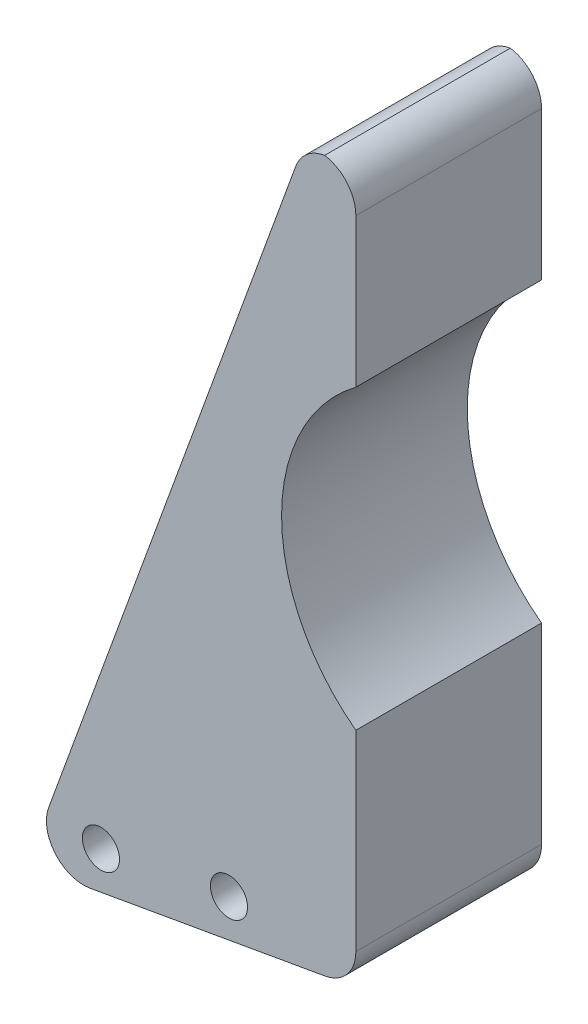
ISO-10303-21;
HEADER;
FILE_DESCRIPTION(('STEP AP214'),'2;1');
FILE_NAME('part.step','',(''),(''),'','','');
FILE_SCHEMA(('AUTOMOTIVE_DESIGN { 1 0 10303 214 1 1 1 1 }'));
ENDSEC;
DATA;
#1=APPLICATION_CONTEXT('core data for automotive mechanical design processes');
#2=APPLICATION_PROTOCOL_DEFINITION('international standard','automotive_design',2000,#1);
#3=PRODUCT_CONTEXT('',#1,'mechanical');
#4=PRODUCT('Part','Part','',(#3));
#5=PRODUCT_RELATED_PRODUCT_CATEGORY('part','',(#4));
#6=PRODUCT_DEFINITION_FORMATION('','',#4);
#7=PRODUCT_DEFINITION_CONTEXT('part definition',#1,'design');
#8=PRODUCT_DEFINITION('design','',#6,#7);
#9=PRODUCT_DEFINITION_SHAPE('','',#8);
#10=(LENGTH_UNIT() NAMED_UNIT(*) SI_UNIT(.MILLI.,.METRE.));
#11=(NAMED_UNIT(*) PLANE_ANGLE_UNIT() SI_UNIT($,.RADIAN.));
#12=(NAMED_UNIT(*) SI_UNIT($,.STERADIAN.) SOLID_ANGLE_UNIT());
#13=UNCERTAINTY_MEASURE_WITH_UNIT(LENGTH_MEASURE(1.E-05),#10,'distance_accuracy_value','');
#14=(GEOMETRIC_REPRESENTATION_CONTEXT(3) GLOBAL_UNCERTAINTY_ASSIGNED_CONTEXT((#13)) GLOBAL_UNIT_ASSIGNED_CONTEXT((#10,
#11,#12)) REPRESENTATION_CONTEXT('',''));
#15=CARTESIAN_POINT('',(0.,0.,0.));
#16=DIRECTION('',(0.,0.,1.));
#17=DIRECTION('',(1.,0.,0.));
#18=AXIS2_PLACEMENT_3D('',#15,#16,#17);
#19=CARTESIAN_POINT('',(-88.6326977710988,-15.6283359900234,50.));
#20=DIRECTION('',(-0.173648177666927,0.984807753012209,0.));
#21=DIRECTION('',(-0.984807753012209,-0.173648177666927,0.));
#22=AXIS2_PLACEMENT_3D('',#19,#20,#21);
#23=PLANE('',#22);
#24=DIRECTION('',(0.984807753012209,0.173648177666927,0.));
#25=VECTOR('',#24,1.);
#26=CARTESIAN_POINT('',(-88.6326977710988,-15.6283359900234,15.));
#27=LINE('',#26,#25);
#28=CARTESIAN_POINT('',(-71.5753271320498,-12.6206613264148,15.));
#29=VERTEX_POINT('',#28);
#30=CARTESIAN_POINT('',(-59.5101578468379,-10.4932464546169,15.));
#31=VERTEX_POINT('',#30);
#32=EDGE_CURVE('E229',#29,#31,#27,.T.);
#33=ORIENTED_EDGE('',*,*,#32,.F.);
#34=DIRECTION('',(0.,0.,-1.));
#35=VECTOR('',#34,1.);
#36=CARTESIAN_POINT('',(-71.5753271320498,-12.6206613264148,50.));
#37=LINE('',#36,#35);
#38=CARTESIAN_POINT('',(-71.5753271320498,-12.6206613264148,0.));
#39=VERTEX_POINT('',#38);
#40=EDGE_CURVE('E166',#29,#39,#37,.T.);
#41=ORIENTED_EDGE('',*,*,#40,.T.);
#42=DIRECTION('',(0.984807753012209,0.173648177666927,0.));
#43=VECTOR('',#42,1.);
#44=CARTESIAN_POINT('',(-88.6326977710988,-15.6283359900234,0.));
#45=LINE('',#44,#43);
#46=CARTESIAN_POINT('',(-8.26351822333074,-1.45708121834926,0.));
#47=VERTEX_POINT('',#46);
#48=EDGE_CURVE('E200',#39,#47,#45,.T.);
#49=ORIENTED_EDGE('',*,*,#48,.T.);
#50=DIRECTION('',(0.,0.,-1.));
#51=VECTOR('',#50,1.);
#52=CARTESIAN_POINT('',(-8.26351822333073,-1.45708121834926,50.));
#53=LINE('',#52,#51);
#54=CARTESIAN_POINT('',(-8.26351822333074,-1.45708121834926,50.));
#55=VERTEX_POINT('',#54);
#56=EDGE_CURVE('E164',#47,#55,#53,.F.);
#57=ORIENTED_EDGE('',*,*,#56,.T.);
#58=DIRECTION('',(0.984807753012209,0.173648177666927,0.));
#59=VECTOR('',#58,1.);
#60=CARTESIAN_POINT('',(-88.6326977710988,-15.6283359900234,50.));
#61=LINE('',#60,#59);
#62=CARTESIAN_POINT('',(-71.5753271320498,-12.6206613264148,50.));
#63=VERTEX_POINT('',#62);
#64=EDGE_CURVE('E194',#63,#55,#61,.T.);
#65=ORIENTED_EDGE('',*,*,#64,.F.);
#66=CARTESIAN_POINT('',(-71.5753271320498,-12.6206613264148,35.));
#67=VERTEX_POINT('',#66);
#68=EDGE_CURVE('E170',#63,#67,#37,.T.);
#69=ORIENTED_EDGE('',*,*,#68,.T.);
#70=DIRECTION('',(0.984807753012209,0.173648177666927,0.));
#71=VECTOR('',#70,1.);
#72=CARTESIAN_POINT('',(-88.6326977710988,-15.6283359900234,35.));
#73=LINE('',#72,#71);
#74=CARTESIAN_POINT('',(-59.5101578468379,-10.4932464546169,35.));
#75=VERTEX_POINT('',#74);
#76=EDGE_CURVE('E53',#67,#75,#73,.T.);
#77=ORIENTED_EDGE('',*,*,#76,.T.);
#78=DIRECTION('',(0.,0.,1.));
#79=VECTOR('',#78,1.);
#80=CARTESIAN_POINT('',(-59.5101578468379,-10.4932464546169,15.));
#81=LINE('',#80,#79);
#82=EDGE_CURVE('E142',#75,#31,#81,.F.);
#83=ORIENTED_EDGE('',*,*,#82,.T.);
#84=EDGE_LOOP('',(#33,#41,#49,#57,#65,#69,#77,#83));
#85=FACE_BOUND('',#84,.T.);
#86=ADVANCED_FACE('F39',(#85),#23,.F.);
#87=CARTESIAN_POINT('',(-68.6326977710988,-1.94753025699676,50.));
#88=DIRECTION('',(0.,0.,-1.));
#89=DIRECTION('',(-1.,0.,0.));
#90=AXIS2_PLACEMENT_3D('',#87,#88,#89);
#91=CYLINDRICAL_SURFACE('',#90,5.);
#92=CARTESIAN_POINT('',(-68.6326977710988,-1.94753025699676,0.));
#93=DIRECTION('',(0.,0.,1.));
#94=DIRECTION('',(1.,0.,0.));
#95=AXIS2_PLACEMENT_3D('',#92,#93,#94);
#96=CIRCLE('',#95,5.);
#97=CARTESIAN_POINT('',(-63.6326977710988,-1.94753025699676,0.));
#98=VERTEX_POINT('',#97);
#99=EDGE_CURVE('E213',#98,#98,#96,.T.);
#100=ORIENTED_EDGE('',*,*,#99,.F.);
#101=EDGE_LOOP('',(#100));
#102=FACE_BOUND('',#101,.T.);
#103=CARTESIAN_POINT('',(-68.6326977710988,-1.94753025699676,15.));
#104=DIRECTION('',(0.,0.,1.));
#105=DIRECTION('',(1.,0.,0.));
#106=AXIS2_PLACEMENT_3D('',#103,#104,#105);
#107=CIRCLE('',#106,5.);
#108=CARTESIAN_POINT('',(-63.6326977710988,-1.94753025699676,15.));
#109=VERTEX_POINT('',#108);
#110=EDGE_CURVE('E221',#109,#109,#107,.T.);
#111=ORIENTED_EDGE('',*,*,#110,.T.);
#112=EDGE_LOOP('',(#111));
#113=FACE_BOUND('',#112,.T.);
#114=ADVANCED_FACE('F292',(#102,#113),#91,.F.);
#115=CARTESIAN_POINT('',(-73.3118089087191,-2.77258379629269,50.));
#116=DIRECTION('',(0.,0.,-1.));
#117=DIRECTION('',(-1.,0.,0.));
#118=AXIS2_PLACEMENT_3D('',#115,#116,#117);
#119=CYLINDRICAL_SURFACE('',#118,10.);
#120=ORIENTED_EDGE('',*,*,#40,.F.);
#121=CARTESIAN_POINT('',(-73.3118089087191,-2.77258379629269,15.));
#122=DIRECTION('',(0.,0.,1.));
#123=DIRECTION('',(1.,0.,0.));
#124=AXIS2_PLACEMENT_3D('',#121,#122,#123);
#125=CIRCLE('',#124,10.);
#126=CARTESIAN_POINT('',(-75.1779766659227,-12.5969116563538,15.));
#127=VERTEX_POINT('',#126);
#128=EDGE_CURVE('E11',#29,#127,#125,.F.);
#129=ORIENTED_EDGE('',*,*,#128,.T.);
#130=DIRECTION('',(0.,0.,1.));
#131=VECTOR('',#130,1.);
#132=CARTESIAN_POINT('',(-75.1779766659227,-12.5969116563538,25.));
#133=LINE('',#132,#131);
#134=CARTESIAN_POINT('',(-75.1779766659227,-12.5969116563538,35.));
#135=VERTEX_POINT('',#134);
#136=EDGE_CURVE('E50',#135,#127,#133,.F.);
#137=ORIENTED_EDGE('',*,*,#136,.F.);
#138=CARTESIAN_POINT('',(-73.3118089087191,-2.77258379629269,35.));
#139=DIRECTION('',(0.,0.,1.));
#140=DIRECTION('',(1.,0.,0.));
#141=AXIS2_PLACEMENT_3D('',#138,#139,#140);
#142=CIRCLE('',#141,10.);
#143=EDGE_CURVE('E130',#67,#135,#142,.F.);
#144=ORIENTED_EDGE('',*,*,#143,.F.);
#145=ORIENTED_EDGE('',*,*,#68,.F.);
#146=CARTESIAN_POINT('',(-73.3118089087191,-2.77258379629269,50.));
#147=DIRECTION('',(0.,0.,1.));
#148=DIRECTION('',(1.,0.,0.));
#149=AXIS2_PLACEMENT_3D('',#146,#147,#148);
#150=CIRCLE('',#149,10.);
#151=CARTESIAN_POINT('',(-82.7087351165782,0.647617636963999,50.));
#152=VERTEX_POINT('',#151);
#153=EDGE_CURVE('E159',#152,#63,#150,.T.);
#154=ORIENTED_EDGE('',*,*,#153,.F.);
#155=DIRECTION('',(0.,0.,-1.));
#156=VECTOR('',#155,1.);
#157=CARTESIAN_POINT('',(-82.7087351165781,0.64761763696411,50.));
#158=LINE('',#157,#156);
#159=CARTESIAN_POINT('',(-82.7087351165782,0.647617636963999,0.));
#160=VERTEX_POINT('',#159);
#161=EDGE_CURVE('E153',#160,#152,#158,.F.);
#162=ORIENTED_EDGE('',*,*,#161,.F.);
#163=CARTESIAN_POINT('',(-73.3118089087191,-2.77258379629269,0.));
#164=DIRECTION('',(0.,0.,1.));
#165=DIRECTION('',(1.,0.,0.));
#166=AXIS2_PLACEMENT_3D('',#163,#164,#165);
#167=CIRCLE('',#166,10.);
#168=EDGE_CURVE('E174',#39,#160,#167,.F.);
#169=ORIENTED_EDGE('',*,*,#168,.F.);
#170=EDGE_LOOP('',(#120,#129,#137,#144,#145,#154,#162,#169));
#171=FACE_BOUND('',#170,.T.);
#172=ADVANCED_FACE('F148',(#171),#119,.T.);
#173=CARTESIAN_POINT('',(30.,100.,50.));
#174=DIRECTION('',(0.,0.,1.));
#175=DIRECTION('',(1.,0.,0.));
#176=AXIS2_PLACEMENT_3D('',#173,#174,#175);
#177=PLANE('',#176);
#178=CARTESIAN_POINT('',(-68.6326977710988,-1.94753025699676,50.));
#179=DIRECTION('',(0.,0.,1.));
#180=DIRECTION('',(1.,0.,0.));
#181=AXIS2_PLACEMENT_3D('',#178,#179,#180);
#182=CIRCLE('',#181,5.);
#183=CARTESIAN_POINT('',(-63.6326977710988,-1.94753025699676,50.));
#184=VERTEX_POINT('',#183);
#185=EDGE_CURVE('E205',#184,#184,#182,.T.);
#186=ORIENTED_EDGE('',*,*,#185,.F.);
#187=EDGE_LOOP('',(#186));
#188=FACE_BOUND('',#187,.T.);
#189=ORIENTED_EDGE('',*,*,#64,.T.);
#190=CARTESIAN_POINT('',(-10.,8.39099631177283,50.));
#191=DIRECTION('',(0.,0.,1.));
#192=DIRECTION('',(1.,0.,0.));
#193=AXIS2_PLACEMENT_3D('',#190,#191,#192);
#194=CIRCLE('',#193,10.);
#195=CARTESIAN_POINT('',(0.,8.39099631177282,50.));
#196=VERTEX_POINT('',#195);
#197=EDGE_CURVE('E158',#55,#196,#194,.T.);
#198=ORIENTED_EDGE('',*,*,#197,.T.);
#199=DIRECTION('',(0.,1.,0.));
#200=VECTOR('',#199,1.);
#201=CARTESIAN_POINT('',(0.,0.,50.));
#202=LINE('',#201,#200);
#203=CARTESIAN_POINT('',(0.,60.,50.));
#204=VERTEX_POINT('',#203);
#205=EDGE_CURVE('E207',#196,#204,#202,.T.);
#206=ORIENTED_EDGE('',*,*,#205,.T.);
#207=CARTESIAN_POINT('',(30.,100.,50.));
#208=DIRECTION('',(0.,0.,-1.));
#209=DIRECTION('',(1.,0.,0.));
#210=AXIS2_PLACEMENT_3D('',#207,#208,#209);
#211=CIRCLE('',#210,50.);
#212=CARTESIAN_POINT('',(0.,140.,50.));
#213=VERTEX_POINT('',#212);
#214=EDGE_CURVE('E210',#204,#213,#211,.T.);
#215=ORIENTED_EDGE('',*,*,#214,.T.);
#216=DIRECTION('',(0.,1.,0.));
#217=VECTOR('',#216,1.);
#218=CARTESIAN_POINT('',(0.,140.,50.));
#219=LINE('',#218,#217);
#220=CARTESIAN_POINT('',(0.,180.,50.));
#221=VERTEX_POINT('',#220);
#222=EDGE_CURVE('E202',#213,#221,#219,.T.);
#223=ORIENTED_EDGE('',*,*,#222,.T.);
#224=CARTESIAN_POINT('',(-10.,180.,50.));
#225=DIRECTION('',(0.,0.,1.));
#226=DIRECTION('',(1.,0.,0.));
#227=AXIS2_PLACEMENT_3D('',#224,#225,#226);
#228=CIRCLE('',#227,10.);
#229=CARTESIAN_POINT('',(-8.39401438347084,189.870198083093,50.));
#230=VERTEX_POINT('',#229);
#231=EDGE_CURVE('E64',#221,#230,#228,.T.);
#232=ORIENTED_EDGE('',*,*,#231,.T.);
#233=CARTESIAN_POINT('',(-6.78802876694168,180.,50.));
#234=DIRECTION('',(0.,0.,1.));
#235=DIRECTION('',(1.,0.,0.));
#236=AXIS2_PLACEMENT_3D('',#233,#234,#235);
#237=CIRCLE('',#236,10.);
#238=CARTESIAN_POINT('',(-16.1849549748007,183.420201433257,50.));
#239=VERTEX_POINT('',#238);
#240=EDGE_CURVE('E165',#230,#239,#237,.T.);
#241=ORIENTED_EDGE('',*,*,#240,.T.);
#242=DIRECTION('',(-0.342020143325676,-0.939692620785906,0.));
#243=VECTOR('',#242,1.);
#244=CARTESIAN_POINT('',(-13.7901041490387,190.,50.));
#245=LINE('',#244,#243);
#246=EDGE_CURVE('E189',#239,#152,#245,.T.);
#247=ORIENTED_EDGE('',*,*,#246,.T.);
#248=ORIENTED_EDGE('',*,*,#153,.T.);
#249=EDGE_LOOP('',(#189,#198,#206,#215,#223,#232,#241,#247,#248));
#250=FACE_BOUND('',#249,.T.);
#251=CARTESIAN_POINT('',(-34.1644264156715,4.13015596134569,50.));
#252=DIRECTION('',(0.,0.,1.));
#253=DIRECTION('',(1.,0.,0.));
#254=AXIS2_PLACEMENT_3D('',#251,#252,#253);
#255=CIRCLE('',#254,5.);
#256=CARTESIAN_POINT('',(-29.1644264156715,4.13015596134569,50.));
#257=VERTEX_POINT('',#256);
#258=EDGE_CURVE('E216',#257,#257,#255,.T.);
#259=ORIENTED_EDGE('',*,*,#258,.F.);
#260=EDGE_LOOP('',(#259));
#261=FACE_BOUND('',#260,.T.);
#262=ADVANCED_FACE('F243',(#188,#250,#261),#177,.T.);
#263=CARTESIAN_POINT('',(30.,100.,0.));
#264=DIRECTION('',(0.,0.,1.));
#265=DIRECTION('',(1.,0.,0.));
#266=AXIS2_PLACEMENT_3D('',#263,#264,#265);
#267=PLANE('',#266);
#268=DIRECTION('',(0.,1.,0.));
#269=VECTOR('',#268,1.);
#270=CARTESIAN_POINT('',(0.,0.,0.));
#271=LINE('',#270,#269);
#272=CARTESIAN_POINT('',(0.,8.39099631177282,0.));
#273=VERTEX_POINT('',#272);
#274=CARTESIAN_POINT('',(0.,60.,0.));
#275=VERTEX_POINT('',#274);
#276=EDGE_CURVE('E197',#273,#275,#271,.T.);
#277=ORIENTED_EDGE('',*,*,#276,.F.);
#278=CARTESIAN_POINT('',(-10.,8.39099631177283,0.));
#279=DIRECTION('',(0.,0.,1.));
#280=DIRECTION('',(1.,0.,0.));
#281=AXIS2_PLACEMENT_3D('',#278,#279,#280);
#282=CIRCLE('',#281,10.);
#283=EDGE_CURVE('E168',#273,#47,#282,.F.);
#284=ORIENTED_EDGE('',*,*,#283,.T.);
#285=ORIENTED_EDGE('',*,*,#48,.F.);
#286=ORIENTED_EDGE('',*,*,#168,.T.);
#287=DIRECTION('',(-0.342020143325676,-0.939692620785906,0.));
#288=VECTOR('',#287,1.);
#289=CARTESIAN_POINT('',(-13.7901041490387,190.,0.));
#290=LINE('',#289,#288);
#291=CARTESIAN_POINT('',(-16.1849549748007,183.420201433257,0.));
#292=VERTEX_POINT('',#291);
#293=EDGE_CURVE('E187',#292,#160,#290,.T.);
#294=ORIENTED_EDGE('',*,*,#293,.F.);
#295=CARTESIAN_POINT('',(-6.78802876694168,180.,0.));
#296=DIRECTION('',(0.,0.,1.));
#297=DIRECTION('',(1.,0.,0.));
#298=AXIS2_PLACEMENT_3D('',#295,#296,#297);
#299=CIRCLE('',#298,10.);
#300=CARTESIAN_POINT('',(-8.39401438347084,189.870198083093,0.));
#301=VERTEX_POINT('',#300);
#302=EDGE_CURVE('E175',#292,#301,#299,.F.);
#303=ORIENTED_EDGE('',*,*,#302,.T.);
#304=CARTESIAN_POINT('',(-10.,180.,0.));
#305=DIRECTION('',(0.,0.,1.));
#306=DIRECTION('',(1.,0.,0.));
#307=AXIS2_PLACEMENT_3D('',#304,#305,#306);
#308=CIRCLE('',#307,10.);
#309=CARTESIAN_POINT('',(0.,180.,0.));
#310=VERTEX_POINT('',#309);
#311=EDGE_CURVE('E179',#301,#310,#308,.F.);
#312=ORIENTED_EDGE('',*,*,#311,.T.);
#313=DIRECTION('',(0.,1.,0.));
#314=VECTOR('',#313,1.);
#315=CARTESIAN_POINT('',(0.,140.,0.));
#316=LINE('',#315,#314);
#317=CARTESIAN_POINT('',(0.,140.,0.));
#318=VERTEX_POINT('',#317);
#319=EDGE_CURVE('E191',#318,#310,#316,.T.);
#320=ORIENTED_EDGE('',*,*,#319,.F.);
#321=CARTESIAN_POINT('',(30.,100.,0.));
#322=DIRECTION('',(0.,0.,-1.));
#323=DIRECTION('',(1.,0.,0.));
#324=AXIS2_PLACEMENT_3D('',#321,#322,#323);
#325=CIRCLE('',#324,50.);
#326=EDGE_CURVE('E192',#275,#318,#325,.T.);
#327=ORIENTED_EDGE('',*,*,#326,.F.);
#328=EDGE_LOOP('',(#277,#284,#285,#286,#294,#303,#312,#320,#327));
#329=FACE_BOUND('',#328,.T.);
#330=ORIENTED_EDGE('',*,*,#99,.T.);
#331=EDGE_LOOP('',(#330));
#332=FACE_BOUND('',#331,.T.);
#333=CARTESIAN_POINT('',(-34.1644264156715,4.13015596134569,0.));
#334=DIRECTION('',(0.,0.,1.));
#335=DIRECTION('',(1.,0.,0.));
#336=AXIS2_PLACEMENT_3D('',#333,#334,#335);
#337=CIRCLE('',#336,5.);
#338=CARTESIAN_POINT('',(-29.1644264156715,4.13015596134569,0.));
#339=VERTEX_POINT('',#338);
#340=EDGE_CURVE('E151',#339,#339,#337,.T.);
#341=ORIENTED_EDGE('',*,*,#340,.T.);
#342=EDGE_LOOP('',(#341));
#343=FACE_BOUND('',#342,.T.);
#344=ADVANCED_FACE('F254',(#329,#332,#343),#267,.F.);
#345=CARTESIAN_POINT('',(0.,0.,50.));
#346=DIRECTION('',(-1.,0.,0.));
#347=DIRECTION('',(0.,0.,1.));
#348=AXIS2_PLACEMENT_3D('',#345,#346,#347);
#349=PLANE('',#348);
#350=ORIENTED_EDGE('',*,*,#205,.F.);
#351=DIRECTION('',(0.,0.,-1.));
#352=VECTOR('',#351,1.);
#353=CARTESIAN_POINT('',(0.,8.39099631177283,50.));
#354=LINE('',#353,#352);
#355=EDGE_CURVE('E180',#196,#273,#354,.T.);
#356=ORIENTED_EDGE('',*,*,#355,.T.);
#357=ORIENTED_EDGE('',*,*,#276,.T.);
#358=DIRECTION('',(0.,0.,-1.));
#359=VECTOR('',#358,1.);
#360=CARTESIAN_POINT('',(0.,60.,50.));
#361=LINE('',#360,#359);
#362=EDGE_CURVE('E182',#204,#275,#361,.T.);
#363=ORIENTED_EDGE('',*,*,#362,.F.);
#364=EDGE_LOOP('',(#350,#356,#357,#363));
#365=FACE_BOUND('',#364,.T.);
#366=ADVANCED_FACE('F275',(#365),#349,.F.);
#367=CARTESIAN_POINT('',(30.,100.,50.));
#368=DIRECTION('',(0.,0.,-1.));
#369=DIRECTION('',(-1.,0.,0.));
#370=AXIS2_PLACEMENT_3D('',#367,#368,#369);
#371=CYLINDRICAL_SURFACE('',#370,50.);
#372=ORIENTED_EDGE('',*,*,#326,.T.);
#373=DIRECTION('',(0.,0.,-1.));
#374=VECTOR('',#373,1.);
#375=CARTESIAN_POINT('',(0.,140.,50.));
#376=LINE('',#375,#374);
#377=EDGE_CURVE('E184',#213,#318,#376,.T.);
#378=ORIENTED_EDGE('',*,*,#377,.F.);
#379=ORIENTED_EDGE('',*,*,#214,.F.);
#380=ORIENTED_EDGE('',*,*,#362,.T.);
#381=EDGE_LOOP('',(#372,#378,#379,#380));
#382=FACE_BOUND('',#381,.T.);
#383=ADVANCED_FACE('F268',(#382),#371,.F.);
#384=CARTESIAN_POINT('',(0.,140.,50.));
#385=DIRECTION('',(-1.,0.,0.));
#386=DIRECTION('',(0.,0.,1.));
#387=AXIS2_PLACEMENT_3D('',#384,#385,#386);
#388=PLANE('',#387);
#389=ORIENTED_EDGE('',*,*,#319,.T.);
#390=DIRECTION('',(0.,0.,-1.));
#391=VECTOR('',#390,1.);
#392=CARTESIAN_POINT('',(0.,180.,50.));
#393=LINE('',#392,#391);
#394=EDGE_CURVE('E131',#310,#221,#393,.F.);
#395=ORIENTED_EDGE('',*,*,#394,.T.);
#396=ORIENTED_EDGE('',*,*,#222,.F.);
#397=ORIENTED_EDGE('',*,*,#377,.T.);
#398=EDGE_LOOP('',(#389,#395,#396,#397));
#399=FACE_BOUND('',#398,.T.);
#400=ADVANCED_FACE('F265',(#399),#388,.F.);
#401=CARTESIAN_POINT('',(-13.7901041490387,190.,50.));
#402=DIRECTION('',(0.939692620785906,-0.342020143325676,0.));
#403=DIRECTION('',(0.342020143325676,0.939692620785906,0.));
#404=AXIS2_PLACEMENT_3D('',#401,#402,#403);
#405=PLANE('',#404);
#406=ORIENTED_EDGE('',*,*,#293,.T.);
#407=ORIENTED_EDGE('',*,*,#161,.T.);
#408=ORIENTED_EDGE('',*,*,#246,.F.);
#409=DIRECTION('',(0.,0.,-1.));
#410=VECTOR('',#409,1.);
#411=CARTESIAN_POINT('',(-16.1849549748007,183.420201433257,50.));
#412=LINE('',#411,#410);
#413=EDGE_CURVE('E154',#239,#292,#412,.T.);
#414=ORIENTED_EDGE('',*,*,#413,.T.);
#415=EDGE_LOOP('',(#406,#407,#408,#414));
#416=FACE_BOUND('',#415,.T.);
#417=ADVANCED_FACE('F250',(#416),#405,.F.);
#418=CARTESIAN_POINT('',(-68.6326977710988,-1.94753025699676,35.));
#419=DIRECTION('',(0.,0.,1.));
#420=DIRECTION('',(1.,0.,0.));
#421=AXIS2_PLACEMENT_3D('',#418,#419,#420);
#422=CIRCLE('',#421,5.);
#423=CARTESIAN_POINT('',(-63.6326977710988,-1.94753025699676,35.));
#424=VERTEX_POINT('',#423);
#425=EDGE_CURVE('E230',#424,#424,#422,.T.);
#426=ORIENTED_EDGE('',*,*,#425,.F.);
#427=EDGE_LOOP('',(#426));
#428=FACE_BOUND('',#427,.T.);
#429=ORIENTED_EDGE('',*,*,#185,.T.);
#430=EDGE_LOOP('',(#429));
#431=FACE_BOUND('',#430,.T.);
#432=ADVANCED_FACE('F281',(#428,#431),#91,.F.);
#433=CARTESIAN_POINT('',(-34.1644264156715,4.13015596134569,50.));
#434=DIRECTION('',(0.,0.,-1.));
#435=DIRECTION('',(-1.,0.,0.));
#436=AXIS2_PLACEMENT_3D('',#433,#434,#435);
#437=CYLINDRICAL_SURFACE('',#436,5.);
#438=ORIENTED_EDGE('',*,*,#258,.T.);
#439=EDGE_LOOP('',(#438));
#440=FACE_BOUND('',#439,.T.);
#441=ORIENTED_EDGE('',*,*,#340,.F.);
#442=EDGE_LOOP('',(#441));
#443=FACE_BOUND('',#442,.T.);
#444=ADVANCED_FACE('F279',(#440,#443),#437,.F.);
#445=CARTESIAN_POINT('',(-10.,8.39099631177283,50.));
#446=DIRECTION('',(0.,0.,-1.));
#447=DIRECTION('',(-1.,0.,0.));
#448=AXIS2_PLACEMENT_3D('',#445,#446,#447);
#449=CYLINDRICAL_SURFACE('',#448,10.);
#450=ORIENTED_EDGE('',*,*,#197,.F.);
#451=ORIENTED_EDGE('',*,*,#56,.F.);
#452=ORIENTED_EDGE('',*,*,#283,.F.);
#453=ORIENTED_EDGE('',*,*,#355,.F.);
#454=EDGE_LOOP('',(#450,#451,#452,#453));
#455=FACE_BOUND('',#454,.T.);
#456=ADVANCED_FACE('F274',(#455),#449,.T.);
#457=CARTESIAN_POINT('',(-10.,180.,50.));
#458=DIRECTION('',(0.,0.,-1.));
#459=DIRECTION('',(-1.,0.,0.));
#460=AXIS2_PLACEMENT_3D('',#457,#458,#459);
#461=CYLINDRICAL_SURFACE('',#460,10.);
#462=DIRECTION('',(0.,0.,-1.));
#463=VECTOR('',#462,1.);
#464=CARTESIAN_POINT('',(-8.39401438347084,189.870198083093,25.));
#465=LINE('',#464,#463);
#466=EDGE_CURVE('E146',#230,#301,#465,.T.);
#467=ORIENTED_EDGE('',*,*,#466,.F.);
#468=ORIENTED_EDGE('',*,*,#231,.F.);
#469=ORIENTED_EDGE('',*,*,#394,.F.);
#470=ORIENTED_EDGE('',*,*,#311,.F.);
#471=EDGE_LOOP('',(#467,#468,#469,#470));
#472=FACE_BOUND('',#471,.T.);
#473=ADVANCED_FACE('F41',(#472),#461,.T.);
#474=CARTESIAN_POINT('',(-6.78802876694168,180.,50.));
#475=DIRECTION('',(0.,0.,-1.));
#476=DIRECTION('',(-1.,0.,0.));
#477=AXIS2_PLACEMENT_3D('',#474,#475,#476);
#478=CYLINDRICAL_SURFACE('',#477,10.);
#479=ORIENTED_EDGE('',*,*,#240,.F.);
#480=ORIENTED_EDGE('',*,*,#466,.T.);
#481=ORIENTED_EDGE('',*,*,#302,.F.);
#482=ORIENTED_EDGE('',*,*,#413,.F.);
#483=EDGE_LOOP('',(#479,#480,#481,#482));
#484=FACE_BOUND('',#483,.T.);
#485=ADVANCED_FACE('F253',(#484),#478,.T.);
#486=CARTESIAN_POINT('',(-68.6326977710988,-1.94753025699676,15.));
#487=DIRECTION('',(0.,0.,1.));
#488=DIRECTION('',(1.,0.,0.));
#489=AXIS2_PLACEMENT_3D('',#486,#487,#488);
#490=CYLINDRICAL_SURFACE('',#489,12.5);
#491=CARTESIAN_POINT('',(-68.6326977710988,-1.94753025699676,35.));
#492=DIRECTION('',(0.,0.,1.));
#493=DIRECTION('',(1.,0.,0.));
#494=AXIS2_PLACEMENT_3D('',#491,#492,#493);
#495=CIRCLE('',#494,12.5);
#496=EDGE_CURVE('E128',#75,#135,#495,.T.);
#497=ORIENTED_EDGE('',*,*,#496,.T.);
#498=ORIENTED_EDGE('',*,*,#136,.T.);
#499=CARTESIAN_POINT('',(-68.6326977710988,-1.94753025699676,15.));
#500=DIRECTION('',(0.,0.,1.));
#501=DIRECTION('',(1.,0.,0.));
#502=AXIS2_PLACEMENT_3D('',#499,#500,#501);
#503=CIRCLE('',#502,12.5);
#504=EDGE_CURVE('E141',#31,#127,#503,.T.);
#505=ORIENTED_EDGE('',*,*,#504,.F.);
#506=ORIENTED_EDGE('',*,*,#82,.F.);
#507=EDGE_LOOP('',(#497,#498,#505,#506));
#508=FACE_BOUND('',#507,.T.);
#509=ADVANCED_FACE('F140',(#508),#490,.F.);
#510=CARTESIAN_POINT('',(-68.6326977710988,-1.94753025699676,15.));
#511=DIRECTION('',(0.,0.,1.));
#512=DIRECTION('',(1.,0.,0.));
#513=AXIS2_PLACEMENT_3D('',#510,#511,#512);
#514=PLANE('',#513);
#515=ORIENTED_EDGE('',*,*,#110,.F.);
#516=EDGE_LOOP('',(#515));
#517=FACE_BOUND('',#516,.T.);
#518=ORIENTED_EDGE('',*,*,#32,.T.);
#519=ORIENTED_EDGE('',*,*,#504,.T.);
#520=ORIENTED_EDGE('',*,*,#128,.F.);
#521=EDGE_LOOP('',(#518,#519,#520));
#522=FACE_BOUND('',#521,.T.);
#523=ADVANCED_FACE('F233',(#517,#522),#514,.T.);
#524=CARTESIAN_POINT('',(-68.6326977710988,-1.94753025699676,35.));
#525=DIRECTION('',(0.,0.,1.));
#526=DIRECTION('',(1.,0.,0.));
#527=AXIS2_PLACEMENT_3D('',#524,#525,#526);
#528=PLANE('',#527);
#529=ORIENTED_EDGE('',*,*,#425,.T.);
#530=EDGE_LOOP('',(#529));
#531=FACE_BOUND('',#530,.T.);
#532=ORIENTED_EDGE('',*,*,#143,.T.);
#533=ORIENTED_EDGE('',*,*,#496,.F.);
#534=ORIENTED_EDGE('',*,*,#76,.F.);
#535=EDGE_LOOP('',(#532,#533,#534));
#536=FACE_BOUND('',#535,.T.);
#537=ADVANCED_FACE('F129',(#531,#536),#528,.F.);
#538=CLOSED_SHELL('',(#86,#114,#172,#262,#344,#366,#383,#400,#417,#432,#444,#456,#473,#485,#509,
#523,#537));
#539=MANIFOLD_SOLID_BREP('B2',#538);
#540=ADVANCED_BREP_SHAPE_REPRESENTATION('',(#18,#539),#14);
#541=SHAPE_DEFINITION_REPRESENTATION(#9,#540);
ENDSEC;
END-ISO-10303-21;
